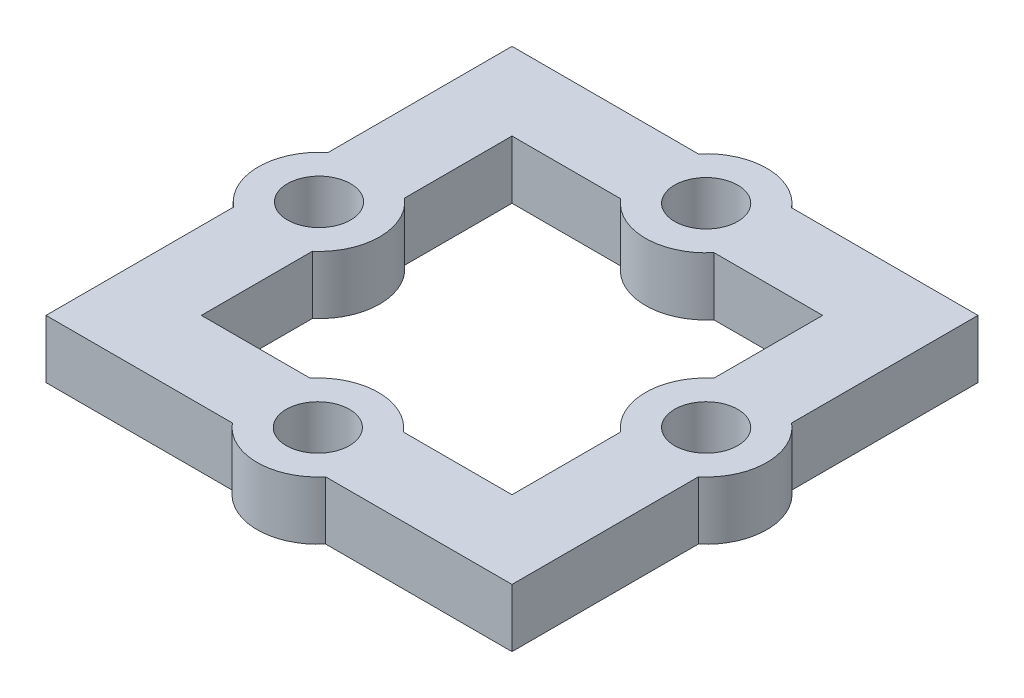
ISO-10303-21;
HEADER;
FILE_DESCRIPTION(('STEP AP214'),'2;1');
FILE_NAME('part.step','',(''),(''),'','','');
FILE_SCHEMA(('AUTOMOTIVE_DESIGN { 1 0 10303 214 1 1 1 1 }'));
ENDSEC;
DATA;
#1=APPLICATION_CONTEXT('core data for automotive mechanical design processes');
#2=APPLICATION_PROTOCOL_DEFINITION('international standard','automotive_design',2000,#1);
#3=PRODUCT_CONTEXT('',#1,'mechanical');
#4=PRODUCT('Part','Part','',(#3));
#5=PRODUCT_RELATED_PRODUCT_CATEGORY('part','',(#4));
#6=PRODUCT_DEFINITION_FORMATION('','',#4);
#7=PRODUCT_DEFINITION_CONTEXT('part definition',#1,'design');
#8=PRODUCT_DEFINITION('design','',#6,#7);
#9=PRODUCT_DEFINITION_SHAPE('','',#8);
#10=(LENGTH_UNIT() NAMED_UNIT(*) SI_UNIT(.MILLI.,.METRE.));
#11=(NAMED_UNIT(*) PLANE_ANGLE_UNIT() SI_UNIT($,.RADIAN.));
#12=(NAMED_UNIT(*) SI_UNIT($,.STERADIAN.) SOLID_ANGLE_UNIT());
#13=UNCERTAINTY_MEASURE_WITH_UNIT(LENGTH_MEASURE(1.E-05),#10,'distance_accuracy_value','');
#14=(GEOMETRIC_REPRESENTATION_CONTEXT(3) GLOBAL_UNCERTAINTY_ASSIGNED_CONTEXT((#13)) GLOBAL_UNIT_ASSIGNED_CONTEXT((#10,
#11,#12)) REPRESENTATION_CONTEXT('',''));
#15=CARTESIAN_POINT('',(0.,0.,0.));
#16=DIRECTION('',(0.,0.,1.));
#17=DIRECTION('',(1.,0.,0.));
#18=AXIS2_PLACEMENT_3D('',#15,#16,#17);
#19=CARTESIAN_POINT('',(20.,6.,0.));
#20=DIRECTION('',(0.,1.,0.));
#21=DIRECTION('',(0.,0.,1.));
#22=AXIS2_PLACEMENT_3D('',#19,#20,#21);
#23=PLANE('',#22);
#24=CARTESIAN_POINT('',(20.,6.,0.));
#25=DIRECTION('',(0.,1.,0.));
#26=DIRECTION('',(0.,0.,1.));
#27=AXIS2_PLACEMENT_3D('',#24,#25,#26);
#28=CIRCLE('',#27,3.25);
#29=CARTESIAN_POINT('',(20.,6.,3.25));
#30=VERTEX_POINT('',#29);
#31=EDGE_CURVE('E752',#30,#30,#28,.T.);
#32=ORIENTED_EDGE('',*,*,#31,.F.);
#33=EDGE_LOOP('',(#32));
#34=FACE_BOUND('',#33,.T.);
#35=CARTESIAN_POINT('',(0.,6.,-20.));
#36=DIRECTION('',(0.,1.,0.));
#37=DIRECTION('',(0.,0.,1.));
#38=AXIS2_PLACEMENT_3D('',#35,#36,#37);
#39=CIRCLE('',#38,3.25);
#40=CARTESIAN_POINT('',(0.,6.,-16.75));
#41=VERTEX_POINT('',#40);
#42=EDGE_CURVE('E474',#41,#41,#39,.T.);
#43=ORIENTED_EDGE('',*,*,#42,.F.);
#44=EDGE_LOOP('',(#43));
#45=FACE_BOUND('',#44,.T.);
#46=DIRECTION('',(1.,0.,0.));
#47=VECTOR('',#46,1.);
#48=CARTESIAN_POINT('',(4.80234317807463,6.,-24.));
#49=LINE('',#48,#47);
#50=CARTESIAN_POINT('',(4.80234317807463,6.,-24.));
#51=VERTEX_POINT('',#50);
#52=CARTESIAN_POINT('',(24.,6.,-24.));
#53=VERTEX_POINT('',#52);
#54=EDGE_CURVE('E523',#51,#53,#49,.T.);
#55=ORIENTED_EDGE('',*,*,#54,.F.);
#56=CARTESIAN_POINT('',(0.,6.,-20.));
#57=DIRECTION('',(0.,1.,0.));
#58=DIRECTION('',(0.,0.,1.));
#59=AXIS2_PLACEMENT_3D('',#56,#57,#58);
#60=CIRCLE('',#59,6.25);
#61=CARTESIAN_POINT('',(-4.80234317807463,6.,-24.));
#62=VERTEX_POINT('',#61);
#63=EDGE_CURVE('E550',#51,#62,#60,.T.);
#64=ORIENTED_EDGE('',*,*,#63,.T.);
#65=DIRECTION('',(1.,0.,0.));
#66=VECTOR('',#65,1.);
#67=CARTESIAN_POINT('',(-24.,6.,-24.));
#68=LINE('',#67,#66);
#69=CARTESIAN_POINT('',(-24.,6.,-24.));
#70=VERTEX_POINT('',#69);
#71=EDGE_CURVE('E547',#70,#62,#68,.T.);
#72=ORIENTED_EDGE('',*,*,#71,.F.);
#73=DIRECTION('',(0.,0.,1.));
#74=VECTOR('',#73,1.);
#75=CARTESIAN_POINT('',(-24.,6.,-24.));
#76=LINE('',#75,#74);
#77=CARTESIAN_POINT('',(-24.,6.,-5.04363246962454));
#78=VERTEX_POINT('',#77);
#79=EDGE_CURVE('E545',#70,#78,#76,.T.);
#80=ORIENTED_EDGE('',*,*,#79,.T.);
#81=CARTESIAN_POINT('',(-20.065667944918,6.,-0.187344660983607));
#82=DIRECTION('',(0.,1.,0.));
#83=DIRECTION('',(0.,0.,1.));
#84=AXIS2_PLACEMENT_3D('',#81,#82,#83);
#85=CIRCLE('',#84,6.25);
#86=CARTESIAN_POINT('',(-24.,6.,4.66894314765733));
#87=VERTEX_POINT('',#86);
#88=EDGE_CURVE('E543',#78,#87,#85,.T.);
#89=ORIENTED_EDGE('',*,*,#88,.T.);
#90=DIRECTION('',(0.,0.,1.));
#91=VECTOR('',#90,1.);
#92=CARTESIAN_POINT('',(-24.,6.,4.66894314765733));
#93=LINE('',#92,#91);
#94=CARTESIAN_POINT('',(-24.,6.,24.));
#95=VERTEX_POINT('',#94);
#96=EDGE_CURVE('E541',#87,#95,#93,.T.);
#97=ORIENTED_EDGE('',*,*,#96,.T.);
#98=DIRECTION('',(1.,0.,0.));
#99=VECTOR('',#98,1.);
#100=CARTESIAN_POINT('',(-24.,6.,24.));
#101=LINE('',#100,#99);
#102=CARTESIAN_POINT('',(-4.80234317807464,6.,24.));
#103=VERTEX_POINT('',#102);
#104=EDGE_CURVE('E539',#95,#103,#101,.T.);
#105=ORIENTED_EDGE('',*,*,#104,.T.);
#106=CARTESIAN_POINT('',(0.,6.,20.));
#107=DIRECTION('',(0.,1.,0.));
#108=DIRECTION('',(0.,0.,1.));
#109=AXIS2_PLACEMENT_3D('',#106,#107,#108);
#110=CIRCLE('',#109,6.25);
#111=CARTESIAN_POINT('',(4.80234317807464,6.,24.));
#112=VERTEX_POINT('',#111);
#113=EDGE_CURVE('E537',#103,#112,#110,.T.);
#114=ORIENTED_EDGE('',*,*,#113,.T.);
#115=DIRECTION('',(1.,0.,0.));
#116=VECTOR('',#115,1.);
#117=CARTESIAN_POINT('',(4.80234317807464,6.,24.));
#118=LINE('',#117,#116);
#119=CARTESIAN_POINT('',(24.,6.,24.));
#120=VERTEX_POINT('',#119);
#121=EDGE_CURVE('E535',#112,#120,#118,.T.);
#122=ORIENTED_EDGE('',*,*,#121,.T.);
#123=DIRECTION('',(0.,0.,1.));
#124=VECTOR('',#123,1.);
#125=CARTESIAN_POINT('',(24.,6.,4.80234317807463));
#126=LINE('',#125,#124);
#127=CARTESIAN_POINT('',(24.,6.,4.80234317807463));
#128=VERTEX_POINT('',#127);
#129=EDGE_CURVE('E532',#128,#120,#126,.T.);
#130=ORIENTED_EDGE('',*,*,#129,.F.);
#131=CARTESIAN_POINT('',(20.,6.,0.));
#132=DIRECTION('',(0.,1.,0.));
#133=DIRECTION('',(0.,0.,1.));
#134=AXIS2_PLACEMENT_3D('',#131,#132,#133);
#135=CIRCLE('',#134,6.25);
#136=CARTESIAN_POINT('',(24.,6.,-4.80234317807464));
#137=VERTEX_POINT('',#136);
#138=EDGE_CURVE('E530',#128,#137,#135,.T.);
#139=ORIENTED_EDGE('',*,*,#138,.T.);
#140=DIRECTION('',(0.,0.,1.));
#141=VECTOR('',#140,1.);
#142=CARTESIAN_POINT('',(24.,6.,-24.));
#143=LINE('',#142,#141);
#144=EDGE_CURVE('E526',#53,#137,#143,.T.);
#145=ORIENTED_EDGE('',*,*,#144,.F.);
#146=EDGE_LOOP('',(#55,#64,#72,#80,#89,#97,#105,#114,#122,#130,#139,#145));
#147=FACE_BOUND('',#146,.T.);
#148=DIRECTION('',(0.,0.,1.));
#149=VECTOR('',#148,1.);
#150=CARTESIAN_POINT('',(16.,6.,4.80234317807464));
#151=LINE('',#150,#149);
#152=CARTESIAN_POINT('',(16.,6.,4.80234317807464));
#153=VERTEX_POINT('',#152);
#154=CARTESIAN_POINT('',(16.,6.,16.));
#155=VERTEX_POINT('',#154);
#156=EDGE_CURVE('E431',#153,#155,#151,.T.);
#157=ORIENTED_EDGE('',*,*,#156,.T.);
#158=DIRECTION('',(1.,0.,0.));
#159=VECTOR('',#158,1.);
#160=CARTESIAN_POINT('',(4.80234317807463,6.,16.));
#161=LINE('',#160,#159);
#162=CARTESIAN_POINT('',(4.80234317807463,6.,16.));
#163=VERTEX_POINT('',#162);
#164=EDGE_CURVE('E422',#163,#155,#161,.T.);
#165=ORIENTED_EDGE('',*,*,#164,.F.);
#166=CARTESIAN_POINT('',(0.,6.,20.));
#167=DIRECTION('',(0.,1.,0.));
#168=DIRECTION('',(0.,0.,1.));
#169=AXIS2_PLACEMENT_3D('',#166,#167,#168);
#170=CIRCLE('',#169,6.25);
#171=CARTESIAN_POINT('',(-4.80234317807463,6.,16.));
#172=VERTEX_POINT('',#171);
#173=EDGE_CURVE('E471',#163,#172,#170,.T.);
#174=ORIENTED_EDGE('',*,*,#173,.T.);
#175=DIRECTION('',(1.,0.,0.));
#176=VECTOR('',#175,1.);
#177=CARTESIAN_POINT('',(-16.,6.,16.));
#178=LINE('',#177,#176);
#179=CARTESIAN_POINT('',(-16.,6.,16.));
#180=VERTEX_POINT('',#179);
#181=EDGE_CURVE('E469',#180,#172,#178,.T.);
#182=ORIENTED_EDGE('',*,*,#181,.F.);
#183=DIRECTION('',(0.,0.,1.));
#184=VECTOR('',#183,1.);
#185=CARTESIAN_POINT('',(-16.,6.,4.55953264537958));
#186=LINE('',#185,#184);
#187=CARTESIAN_POINT('',(-16.,6.,4.55953264537958));
#188=VERTEX_POINT('',#187);
#189=EDGE_CURVE('E467',#188,#180,#186,.T.);
#190=ORIENTED_EDGE('',*,*,#189,.F.);
#191=CARTESIAN_POINT('',(-20.065667944918,6.,-0.187344660983607));
#192=DIRECTION('',(0.,1.,0.));
#193=DIRECTION('',(0.,0.,1.));
#194=AXIS2_PLACEMENT_3D('',#191,#192,#193);
#195=CIRCLE('',#194,6.25);
#196=CARTESIAN_POINT('',(-16.,6.,-4.9342219673468));
#197=VERTEX_POINT('',#196);
#198=EDGE_CURVE('E464',#188,#197,#195,.T.);
#199=ORIENTED_EDGE('',*,*,#198,.T.);
#200=DIRECTION('',(0.,0.,1.));
#201=VECTOR('',#200,1.);
#202=CARTESIAN_POINT('',(-16.,6.,-16.));
#203=LINE('',#202,#201);
#204=CARTESIAN_POINT('',(-16.,6.,-16.));
#205=VERTEX_POINT('',#204);
#206=EDGE_CURVE('E462',#205,#197,#203,.T.);
#207=ORIENTED_EDGE('',*,*,#206,.F.);
#208=DIRECTION('',(1.,0.,0.));
#209=VECTOR('',#208,1.);
#210=CARTESIAN_POINT('',(-16.,6.,-16.));
#211=LINE('',#210,#209);
#212=CARTESIAN_POINT('',(-4.80234317807464,6.,-16.));
#213=VERTEX_POINT('',#212);
#214=EDGE_CURVE('E459',#205,#213,#211,.T.);
#215=ORIENTED_EDGE('',*,*,#214,.T.);
#216=CARTESIAN_POINT('',(0.,6.,-20.));
#217=DIRECTION('',(0.,1.,0.));
#218=DIRECTION('',(0.,0.,1.));
#219=AXIS2_PLACEMENT_3D('',#216,#217,#218);
#220=CIRCLE('',#219,6.25);
#221=CARTESIAN_POINT('',(4.80234317807464,6.,-16.));
#222=VERTEX_POINT('',#221);
#223=EDGE_CURVE('E456',#213,#222,#220,.T.);
#224=ORIENTED_EDGE('',*,*,#223,.T.);
#225=DIRECTION('',(1.,0.,0.));
#226=VECTOR('',#225,1.);
#227=CARTESIAN_POINT('',(4.80234317807464,6.,-16.));
#228=LINE('',#227,#226);
#229=CARTESIAN_POINT('',(16.,6.,-16.));
#230=VERTEX_POINT('',#229);
#231=EDGE_CURVE('E453',#222,#230,#228,.T.);
#232=ORIENTED_EDGE('',*,*,#231,.T.);
#233=DIRECTION('',(0.,0.,1.));
#234=VECTOR('',#233,1.);
#235=CARTESIAN_POINT('',(16.,6.,-16.));
#236=LINE('',#235,#234);
#237=CARTESIAN_POINT('',(16.,6.,-4.80234317807465));
#238=VERTEX_POINT('',#237);
#239=EDGE_CURVE('E448',#230,#238,#236,.T.);
#240=ORIENTED_EDGE('',*,*,#239,.T.);
#241=CARTESIAN_POINT('',(20.,6.,0.));
#242=DIRECTION('',(0.,1.,0.));
#243=DIRECTION('',(0.,0.,1.));
#244=AXIS2_PLACEMENT_3D('',#241,#242,#243);
#245=CIRCLE('',#244,6.25);
#246=EDGE_CURVE('E446',#238,#153,#245,.T.);
#247=ORIENTED_EDGE('',*,*,#246,.T.);
#248=EDGE_LOOP('',(#157,#165,#174,#182,#190,#199,#207,#215,#224,#232,#240,#247));
#249=FACE_BOUND('',#248,.T.);
#250=CARTESIAN_POINT('',(0.,6.,20.));
#251=DIRECTION('',(0.,1.,0.));
#252=DIRECTION('',(0.,0.,1.));
#253=AXIS2_PLACEMENT_3D('',#250,#251,#252);
#254=CIRCLE('',#253,3.25);
#255=CARTESIAN_POINT('',(0.,6.,23.25));
#256=VERTEX_POINT('',#255);
#257=EDGE_CURVE('E758',#256,#256,#254,.T.);
#258=ORIENTED_EDGE('',*,*,#257,.F.);
#259=EDGE_LOOP('',(#258));
#260=FACE_BOUND('',#259,.T.);
#261=CARTESIAN_POINT('',(-20.065667944918,6.,-0.187344660983607));
#262=DIRECTION('',(0.,1.,0.));
#263=DIRECTION('',(0.,0.,1.));
#264=AXIS2_PLACEMENT_3D('',#261,#262,#263);
#265=CIRCLE('',#264,3.25);
#266=CARTESIAN_POINT('',(-20.065667944918,6.,3.06265533901639));
#267=VERTEX_POINT('',#266);
#268=EDGE_CURVE('E743',#267,#267,#265,.T.);
#269=ORIENTED_EDGE('',*,*,#268,.F.);
#270=EDGE_LOOP('',(#269));
#271=FACE_BOUND('',#270,.T.);
#272=ADVANCED_FACE('F261',(#34,#45,#147,#249,#260,#271),#23,.T.);
#273=CARTESIAN_POINT('',(20.,0.,0.));
#274=DIRECTION('',(0.,1.,0.));
#275=DIRECTION('',(0.,0.,1.));
#276=AXIS2_PLACEMENT_3D('',#273,#274,#275);
#277=PLANE('',#276);
#278=DIRECTION('',(1.,0.,0.));
#279=VECTOR('',#278,1.);
#280=CARTESIAN_POINT('',(4.80234317807463,0.,-24.));
#281=LINE('',#280,#279);
#282=CARTESIAN_POINT('',(4.80234317807463,0.,-24.));
#283=VERTEX_POINT('',#282);
#284=CARTESIAN_POINT('',(24.,0.,-24.));
#285=VERTEX_POINT('',#284);
#286=EDGE_CURVE('E440',#283,#285,#281,.T.);
#287=ORIENTED_EDGE('',*,*,#286,.T.);
#288=DIRECTION('',(0.,0.,1.));
#289=VECTOR('',#288,1.);
#290=CARTESIAN_POINT('',(24.,0.,-24.));
#291=LINE('',#290,#289);
#292=CARTESIAN_POINT('',(24.,0.,-4.80234317807464));
#293=VERTEX_POINT('',#292);
#294=EDGE_CURVE('E554',#285,#293,#291,.T.);
#295=ORIENTED_EDGE('',*,*,#294,.T.);
#296=CARTESIAN_POINT('',(20.,0.,0.));
#297=DIRECTION('',(0.,1.,0.));
#298=DIRECTION('',(0.,0.,1.));
#299=AXIS2_PLACEMENT_3D('',#296,#297,#298);
#300=CIRCLE('',#299,6.25);
#301=CARTESIAN_POINT('',(24.,0.,4.80234317807463));
#302=VERTEX_POINT('',#301);
#303=EDGE_CURVE('E557',#302,#293,#300,.T.);
#304=ORIENTED_EDGE('',*,*,#303,.F.);
#305=DIRECTION('',(0.,0.,1.));
#306=VECTOR('',#305,1.);
#307=CARTESIAN_POINT('',(24.,0.,4.80234317807463));
#308=LINE('',#307,#306);
#309=CARTESIAN_POINT('',(24.,0.,24.));
#310=VERTEX_POINT('',#309);
#311=EDGE_CURVE('E560',#302,#310,#308,.T.);
#312=ORIENTED_EDGE('',*,*,#311,.T.);
#313=DIRECTION('',(1.,0.,0.));
#314=VECTOR('',#313,1.);
#315=CARTESIAN_POINT('',(4.80234317807464,0.,24.));
#316=LINE('',#315,#314);
#317=CARTESIAN_POINT('',(4.80234317807464,0.,24.));
#318=VERTEX_POINT('',#317);
#319=EDGE_CURVE('E563',#318,#310,#316,.T.);
#320=ORIENTED_EDGE('',*,*,#319,.F.);
#321=CARTESIAN_POINT('',(0.,0.,20.));
#322=DIRECTION('',(0.,1.,0.));
#323=DIRECTION('',(0.,0.,1.));
#324=AXIS2_PLACEMENT_3D('',#321,#322,#323);
#325=CIRCLE('',#324,6.25);
#326=CARTESIAN_POINT('',(-4.80234317807464,0.,24.));
#327=VERTEX_POINT('',#326);
#328=EDGE_CURVE('E566',#327,#318,#325,.T.);
#329=ORIENTED_EDGE('',*,*,#328,.F.);
#330=DIRECTION('',(1.,0.,0.));
#331=VECTOR('',#330,1.);
#332=CARTESIAN_POINT('',(-24.,0.,24.));
#333=LINE('',#332,#331);
#334=CARTESIAN_POINT('',(-24.,0.,24.));
#335=VERTEX_POINT('',#334);
#336=EDGE_CURVE('E568',#335,#327,#333,.T.);
#337=ORIENTED_EDGE('',*,*,#336,.F.);
#338=DIRECTION('',(0.,0.,1.));
#339=VECTOR('',#338,1.);
#340=CARTESIAN_POINT('',(-24.,0.,4.66894314765733));
#341=LINE('',#340,#339);
#342=CARTESIAN_POINT('',(-24.,0.,4.66894314765733));
#343=VERTEX_POINT('',#342);
#344=EDGE_CURVE('E570',#343,#335,#341,.T.);
#345=ORIENTED_EDGE('',*,*,#344,.F.);
#346=CARTESIAN_POINT('',(-20.065667944918,0.,-0.187344660983607));
#347=DIRECTION('',(0.,1.,0.));
#348=DIRECTION('',(0.,0.,1.));
#349=AXIS2_PLACEMENT_3D('',#346,#347,#348);
#350=CIRCLE('',#349,6.25);
#351=CARTESIAN_POINT('',(-24.,0.,-5.04363246962454));
#352=VERTEX_POINT('',#351);
#353=EDGE_CURVE('E572',#352,#343,#350,.T.);
#354=ORIENTED_EDGE('',*,*,#353,.F.);
#355=DIRECTION('',(0.,0.,1.));
#356=VECTOR('',#355,1.);
#357=CARTESIAN_POINT('',(-24.,0.,-24.));
#358=LINE('',#357,#356);
#359=CARTESIAN_POINT('',(-24.,0.,-24.));
#360=VERTEX_POINT('',#359);
#361=EDGE_CURVE('E574',#360,#352,#358,.T.);
#362=ORIENTED_EDGE('',*,*,#361,.F.);
#363=DIRECTION('',(1.,0.,0.));
#364=VECTOR('',#363,1.);
#365=CARTESIAN_POINT('',(-24.,0.,-24.));
#366=LINE('',#365,#364);
#367=CARTESIAN_POINT('',(-4.80234317807463,0.,-24.));
#368=VERTEX_POINT('',#367);
#369=EDGE_CURVE('E576',#360,#368,#366,.T.);
#370=ORIENTED_EDGE('',*,*,#369,.T.);
#371=CARTESIAN_POINT('',(0.,0.,-20.));
#372=DIRECTION('',(0.,1.,0.));
#373=DIRECTION('',(0.,0.,1.));
#374=AXIS2_PLACEMENT_3D('',#371,#372,#373);
#375=CIRCLE('',#374,6.25);
#376=EDGE_CURVE('E527',#283,#368,#375,.T.);
#377=ORIENTED_EDGE('',*,*,#376,.F.);
#378=EDGE_LOOP('',(#287,#295,#304,#312,#320,#329,#337,#345,#354,#362,#370,#377));
#379=FACE_BOUND('',#378,.T.);
#380=DIRECTION('',(1.,0.,0.));
#381=VECTOR('',#380,1.);
#382=CARTESIAN_POINT('',(4.80234317807463,0.,16.));
#383=LINE('',#382,#381);
#384=CARTESIAN_POINT('',(4.80234317807463,0.,16.));
#385=VERTEX_POINT('',#384);
#386=CARTESIAN_POINT('',(16.,0.,16.));
#387=VERTEX_POINT('',#386);
#388=EDGE_CURVE('E286',#385,#387,#383,.T.);
#389=ORIENTED_EDGE('',*,*,#388,.T.);
#390=DIRECTION('',(0.,0.,1.));
#391=VECTOR('',#390,1.);
#392=CARTESIAN_POINT('',(16.,0.,4.80234317807464));
#393=LINE('',#392,#391);
#394=CARTESIAN_POINT('',(16.,0.,4.80234317807464));
#395=VERTEX_POINT('',#394);
#396=EDGE_CURVE('E439',#395,#387,#393,.T.);
#397=ORIENTED_EDGE('',*,*,#396,.F.);
#398=CARTESIAN_POINT('',(20.,0.,0.));
#399=DIRECTION('',(0.,1.,0.));
#400=DIRECTION('',(0.,0.,1.));
#401=AXIS2_PLACEMENT_3D('',#398,#399,#400);
#402=CIRCLE('',#401,6.25);
#403=CARTESIAN_POINT('',(16.,0.,-4.80234317807465));
#404=VERTEX_POINT('',#403);
#405=EDGE_CURVE('E476',#404,#395,#402,.T.);
#406=ORIENTED_EDGE('',*,*,#405,.F.);
#407=DIRECTION('',(0.,0.,1.));
#408=VECTOR('',#407,1.);
#409=CARTESIAN_POINT('',(16.,0.,-16.));
#410=LINE('',#409,#408);
#411=CARTESIAN_POINT('',(16.,0.,-16.));
#412=VERTEX_POINT('',#411);
#413=EDGE_CURVE('E479',#412,#404,#410,.T.);
#414=ORIENTED_EDGE('',*,*,#413,.F.);
#415=DIRECTION('',(1.,0.,0.));
#416=VECTOR('',#415,1.);
#417=CARTESIAN_POINT('',(4.80234317807464,0.,-16.));
#418=LINE('',#417,#416);
#419=CARTESIAN_POINT('',(4.80234317807464,0.,-16.));
#420=VERTEX_POINT('',#419);
#421=EDGE_CURVE('E482',#420,#412,#418,.T.);
#422=ORIENTED_EDGE('',*,*,#421,.F.);
#423=CARTESIAN_POINT('',(0.,0.,-20.));
#424=DIRECTION('',(0.,1.,0.));
#425=DIRECTION('',(0.,0.,1.));
#426=AXIS2_PLACEMENT_3D('',#423,#424,#425);
#427=CIRCLE('',#426,6.25);
#428=CARTESIAN_POINT('',(-4.80234317807464,0.,-16.));
#429=VERTEX_POINT('',#428);
#430=EDGE_CURVE('E485',#429,#420,#427,.T.);
#431=ORIENTED_EDGE('',*,*,#430,.F.);
#432=DIRECTION('',(1.,0.,0.));
#433=VECTOR('',#432,1.);
#434=CARTESIAN_POINT('',(-16.,0.,-16.));
#435=LINE('',#434,#433);
#436=CARTESIAN_POINT('',(-16.,0.,-16.));
#437=VERTEX_POINT('',#436);
#438=EDGE_CURVE('E488',#437,#429,#435,.T.);
#439=ORIENTED_EDGE('',*,*,#438,.F.);
#440=DIRECTION('',(0.,0.,1.));
#441=VECTOR('',#440,1.);
#442=CARTESIAN_POINT('',(-16.,0.,-16.));
#443=LINE('',#442,#441);
#444=CARTESIAN_POINT('',(-16.,0.,-4.9342219673468));
#445=VERTEX_POINT('',#444);
#446=EDGE_CURVE('E491',#437,#445,#443,.T.);
#447=ORIENTED_EDGE('',*,*,#446,.T.);
#448=CARTESIAN_POINT('',(-20.065667944918,0.,-0.187344660983607));
#449=DIRECTION('',(0.,1.,0.));
#450=DIRECTION('',(0.,0.,1.));
#451=AXIS2_PLACEMENT_3D('',#448,#449,#450);
#452=CIRCLE('',#451,6.25);
#453=CARTESIAN_POINT('',(-16.,0.,4.55953264537958));
#454=VERTEX_POINT('',#453);
#455=EDGE_CURVE('E494',#454,#445,#452,.T.);
#456=ORIENTED_EDGE('',*,*,#455,.F.);
#457=DIRECTION('',(0.,0.,1.));
#458=VECTOR('',#457,1.);
#459=CARTESIAN_POINT('',(-16.,0.,4.55953264537958));
#460=LINE('',#459,#458);
#461=CARTESIAN_POINT('',(-16.,0.,16.));
#462=VERTEX_POINT('',#461);
#463=EDGE_CURVE('E497',#454,#462,#460,.T.);
#464=ORIENTED_EDGE('',*,*,#463,.T.);
#465=DIRECTION('',(1.,0.,0.));
#466=VECTOR('',#465,1.);
#467=CARTESIAN_POINT('',(-16.,0.,16.));
#468=LINE('',#467,#466);
#469=CARTESIAN_POINT('',(-4.80234317807463,0.,16.));
#470=VERTEX_POINT('',#469);
#471=EDGE_CURVE('E500',#462,#470,#468,.T.);
#472=ORIENTED_EDGE('',*,*,#471,.T.);
#473=CARTESIAN_POINT('',(0.,0.,20.));
#474=DIRECTION('',(0.,1.,0.));
#475=DIRECTION('',(0.,0.,1.));
#476=AXIS2_PLACEMENT_3D('',#473,#474,#475);
#477=CIRCLE('',#476,6.25);
#478=EDGE_CURVE('E432',#385,#470,#477,.T.);
#479=ORIENTED_EDGE('',*,*,#478,.F.);
#480=EDGE_LOOP('',(#389,#397,#406,#414,#422,#431,#439,#447,#456,#464,#472,#479));
#481=FACE_BOUND('',#480,.T.);
#482=CARTESIAN_POINT('',(0.,0.,-20.));
#483=DIRECTION('',(0.,1.,0.));
#484=DIRECTION('',(0.,0.,1.));
#485=AXIS2_PLACEMENT_3D('',#482,#483,#484);
#486=CIRCLE('',#485,3.25);
#487=CARTESIAN_POINT('',(0.,0.,-16.75));
#488=VERTEX_POINT('',#487);
#489=EDGE_CURVE('E761',#488,#488,#486,.T.);
#490=ORIENTED_EDGE('',*,*,#489,.T.);
#491=EDGE_LOOP('',(#490));
#492=FACE_BOUND('',#491,.T.);
#493=CARTESIAN_POINT('',(0.,0.,20.));
#494=DIRECTION('',(0.,1.,0.));
#495=DIRECTION('',(0.,0.,1.));
#496=AXIS2_PLACEMENT_3D('',#493,#494,#495);
#497=CIRCLE('',#496,3.25);
#498=CARTESIAN_POINT('',(0.,0.,23.25));
#499=VERTEX_POINT('',#498);
#500=EDGE_CURVE('E755',#499,#499,#497,.T.);
#501=ORIENTED_EDGE('',*,*,#500,.T.);
#502=EDGE_LOOP('',(#501));
#503=FACE_BOUND('',#502,.T.);
#504=CARTESIAN_POINT('',(20.,0.,0.));
#505=DIRECTION('',(0.,1.,0.));
#506=DIRECTION('',(0.,0.,1.));
#507=AXIS2_PLACEMENT_3D('',#504,#505,#506);
#508=CIRCLE('',#507,3.25);
#509=CARTESIAN_POINT('',(20.,0.,3.25));
#510=VERTEX_POINT('',#509);
#511=EDGE_CURVE('E749',#510,#510,#508,.T.);
#512=ORIENTED_EDGE('',*,*,#511,.T.);
#513=EDGE_LOOP('',(#512));
#514=FACE_BOUND('',#513,.T.);
#515=CARTESIAN_POINT('',(-20.065667944918,0.,-0.187344660983607));
#516=DIRECTION('',(0.,1.,0.));
#517=DIRECTION('',(0.,0.,1.));
#518=AXIS2_PLACEMENT_3D('',#515,#516,#517);
#519=CIRCLE('',#518,3.25);
#520=CARTESIAN_POINT('',(-20.065667944918,0.,3.06265533901639));
#521=VERTEX_POINT('',#520);
#522=EDGE_CURVE('E746',#521,#521,#519,.T.);
#523=ORIENTED_EDGE('',*,*,#522,.T.);
#524=EDGE_LOOP('',(#523));
#525=FACE_BOUND('',#524,.T.);
#526=ADVANCED_FACE('F614',(#379,#481,#492,#503,#514,#525),#277,.F.);
#527=CARTESIAN_POINT('',(4.80234317807463,6.,-24.));
#528=DIRECTION('',(0.,0.,-1.));
#529=DIRECTION('',(-1.,0.,0.));
#530=AXIS2_PLACEMENT_3D('',#527,#528,#529);
#531=PLANE('',#530);
#532=ORIENTED_EDGE('',*,*,#286,.F.);
#533=DIRECTION('',(0.,-1.,0.));
#534=VECTOR('',#533,1.);
#535=CARTESIAN_POINT('',(4.80234317807463,6.,-24.));
#536=LINE('',#535,#534);
#537=EDGE_CURVE('E12',#51,#283,#536,.T.);
#538=ORIENTED_EDGE('',*,*,#537,.F.);
#539=ORIENTED_EDGE('',*,*,#54,.T.);
#540=DIRECTION('',(0.,-1.,0.));
#541=VECTOR('',#540,1.);
#542=CARTESIAN_POINT('',(24.,6.,-24.));
#543=LINE('',#542,#541);
#544=EDGE_CURVE('E265',#53,#285,#543,.T.);
#545=ORIENTED_EDGE('',*,*,#544,.T.);
#546=EDGE_LOOP('',(#532,#538,#539,#545));
#547=FACE_BOUND('',#546,.T.);
#548=ADVANCED_FACE('F263',(#547),#531,.T.);
#549=CARTESIAN_POINT('',(0.,6.,-20.));
#550=DIRECTION('',(0.,-1.,0.));
#551=DIRECTION('',(0.,0.,-1.));
#552=AXIS2_PLACEMENT_3D('',#549,#550,#551);
#553=CYLINDRICAL_SURFACE('',#552,6.25);
#554=ORIENTED_EDGE('',*,*,#376,.T.);
#555=DIRECTION('',(0.,-1.,0.));
#556=VECTOR('',#555,1.);
#557=CARTESIAN_POINT('',(-4.80234317807463,6.,-24.));
#558=LINE('',#557,#556);
#559=EDGE_CURVE('E270',#62,#368,#558,.T.);
#560=ORIENTED_EDGE('',*,*,#559,.F.);
#561=ORIENTED_EDGE('',*,*,#63,.F.);
#562=ORIENTED_EDGE('',*,*,#537,.T.);
#563=EDGE_LOOP('',(#554,#560,#561,#562));
#564=FACE_BOUND('',#563,.T.);
#565=ADVANCED_FACE('F620',(#564),#553,.T.);
#566=CARTESIAN_POINT('',(-24.,6.,-24.));
#567=DIRECTION('',(0.,0.,-1.));
#568=DIRECTION('',(-1.,0.,0.));
#569=AXIS2_PLACEMENT_3D('',#566,#567,#568);
#570=PLANE('',#569);
#571=ORIENTED_EDGE('',*,*,#369,.F.);
#572=DIRECTION('',(0.,-1.,0.));
#573=VECTOR('',#572,1.);
#574=CARTESIAN_POINT('',(-24.,6.,-24.));
#575=LINE('',#574,#573);
#576=EDGE_CURVE('E582',#70,#360,#575,.T.);
#577=ORIENTED_EDGE('',*,*,#576,.F.);
#578=ORIENTED_EDGE('',*,*,#71,.T.);
#579=ORIENTED_EDGE('',*,*,#559,.T.);
#580=EDGE_LOOP('',(#571,#577,#578,#579));
#581=FACE_BOUND('',#580,.T.);
#582=ADVANCED_FACE('F661',(#581),#570,.T.);
#583=CARTESIAN_POINT('',(-24.,6.,-24.));
#584=DIRECTION('',(1.,0.,0.));
#585=DIRECTION('',(0.,0.,-1.));
#586=AXIS2_PLACEMENT_3D('',#583,#584,#585);
#587=PLANE('',#586);
#588=ORIENTED_EDGE('',*,*,#361,.T.);
#589=DIRECTION('',(0.,-1.,0.));
#590=VECTOR('',#589,1.);
#591=CARTESIAN_POINT('',(-24.,6.,-5.04363246962454));
#592=LINE('',#591,#590);
#593=EDGE_CURVE('E584',#78,#352,#592,.T.);
#594=ORIENTED_EDGE('',*,*,#593,.F.);
#595=ORIENTED_EDGE('',*,*,#79,.F.);
#596=ORIENTED_EDGE('',*,*,#576,.T.);
#597=EDGE_LOOP('',(#588,#594,#595,#596));
#598=FACE_BOUND('',#597,.T.);
#599=ADVANCED_FACE('F659',(#598),#587,.F.);
#600=CARTESIAN_POINT('',(-20.065667944918,6.,-0.187344660983607));
#601=DIRECTION('',(0.,-1.,0.));
#602=DIRECTION('',(0.,0.,-1.));
#603=AXIS2_PLACEMENT_3D('',#600,#601,#602);
#604=CYLINDRICAL_SURFACE('',#603,6.25);
#605=ORIENTED_EDGE('',*,*,#353,.T.);
#606=DIRECTION('',(0.,-1.,0.));
#607=VECTOR('',#606,1.);
#608=CARTESIAN_POINT('',(-24.,6.,4.66894314765733));
#609=LINE('',#608,#607);
#610=EDGE_CURVE('E587',#87,#343,#609,.T.);
#611=ORIENTED_EDGE('',*,*,#610,.F.);
#612=ORIENTED_EDGE('',*,*,#88,.F.);
#613=ORIENTED_EDGE('',*,*,#593,.T.);
#614=EDGE_LOOP('',(#605,#611,#612,#613));
#615=FACE_BOUND('',#614,.T.);
#616=ADVANCED_FACE('F654',(#615),#604,.T.);
#617=CARTESIAN_POINT('',(-24.,6.,4.66894314765733));
#618=DIRECTION('',(1.,0.,0.));
#619=DIRECTION('',(0.,0.,-1.));
#620=AXIS2_PLACEMENT_3D('',#617,#618,#619);
#621=PLANE('',#620);
#622=ORIENTED_EDGE('',*,*,#344,.T.);
#623=DIRECTION('',(0.,-1.,0.));
#624=VECTOR('',#623,1.);
#625=CARTESIAN_POINT('',(-24.,6.,24.));
#626=LINE('',#625,#624);
#627=EDGE_CURVE('E590',#95,#335,#626,.T.);
#628=ORIENTED_EDGE('',*,*,#627,.F.);
#629=ORIENTED_EDGE('',*,*,#96,.F.);
#630=ORIENTED_EDGE('',*,*,#610,.T.);
#631=EDGE_LOOP('',(#622,#628,#629,#630));
#632=FACE_BOUND('',#631,.T.);
#633=ADVANCED_FACE('F650',(#632),#621,.F.);
#634=CARTESIAN_POINT('',(-24.,6.,24.));
#635=DIRECTION('',(0.,0.,-1.));
#636=DIRECTION('',(-1.,0.,0.));
#637=AXIS2_PLACEMENT_3D('',#634,#635,#636);
#638=PLANE('',#637);
#639=ORIENTED_EDGE('',*,*,#336,.T.);
#640=DIRECTION('',(0.,-1.,0.));
#641=VECTOR('',#640,1.);
#642=CARTESIAN_POINT('',(-4.80234317807464,6.,24.));
#643=LINE('',#642,#641);
#644=EDGE_CURVE('E593',#103,#327,#643,.T.);
#645=ORIENTED_EDGE('',*,*,#644,.F.);
#646=ORIENTED_EDGE('',*,*,#104,.F.);
#647=ORIENTED_EDGE('',*,*,#627,.T.);
#648=EDGE_LOOP('',(#639,#645,#646,#647));
#649=FACE_BOUND('',#648,.T.);
#650=ADVANCED_FACE('F646',(#649),#638,.F.);
#651=CARTESIAN_POINT('',(0.,6.,20.));
#652=DIRECTION('',(0.,-1.,0.));
#653=DIRECTION('',(0.,0.,-1.));
#654=AXIS2_PLACEMENT_3D('',#651,#652,#653);
#655=CYLINDRICAL_SURFACE('',#654,6.25);
#656=ORIENTED_EDGE('',*,*,#328,.T.);
#657=DIRECTION('',(0.,-1.,0.));
#658=VECTOR('',#657,1.);
#659=CARTESIAN_POINT('',(4.80234317807464,6.,24.));
#660=LINE('',#659,#658);
#661=EDGE_CURVE('E596',#112,#318,#660,.T.);
#662=ORIENTED_EDGE('',*,*,#661,.F.);
#663=ORIENTED_EDGE('',*,*,#113,.F.);
#664=ORIENTED_EDGE('',*,*,#644,.T.);
#665=EDGE_LOOP('',(#656,#662,#663,#664));
#666=FACE_BOUND('',#665,.T.);
#667=ADVANCED_FACE('F641',(#666),#655,.T.);
#668=CARTESIAN_POINT('',(4.80234317807464,6.,24.));
#669=DIRECTION('',(0.,0.,-1.));
#670=DIRECTION('',(-1.,0.,0.));
#671=AXIS2_PLACEMENT_3D('',#668,#669,#670);
#672=PLANE('',#671);
#673=ORIENTED_EDGE('',*,*,#319,.T.);
#674=DIRECTION('',(0.,-1.,0.));
#675=VECTOR('',#674,1.);
#676=CARTESIAN_POINT('',(24.,6.,24.));
#677=LINE('',#676,#675);
#678=EDGE_CURVE('E599',#120,#310,#677,.T.);
#679=ORIENTED_EDGE('',*,*,#678,.F.);
#680=ORIENTED_EDGE('',*,*,#121,.F.);
#681=ORIENTED_EDGE('',*,*,#661,.T.);
#682=EDGE_LOOP('',(#673,#679,#680,#681));
#683=FACE_BOUND('',#682,.T.);
#684=ADVANCED_FACE('F635',(#683),#672,.F.);
#685=CARTESIAN_POINT('',(24.,6.,4.80234317807463));
#686=DIRECTION('',(1.,0.,0.));
#687=DIRECTION('',(0.,0.,-1.));
#688=AXIS2_PLACEMENT_3D('',#685,#686,#687);
#689=PLANE('',#688);
#690=ORIENTED_EDGE('',*,*,#311,.F.);
#691=DIRECTION('',(0.,-1.,0.));
#692=VECTOR('',#691,1.);
#693=CARTESIAN_POINT('',(24.,6.,4.80234317807463));
#694=LINE('',#693,#692);
#695=EDGE_CURVE('E601',#128,#302,#694,.T.);
#696=ORIENTED_EDGE('',*,*,#695,.F.);
#697=ORIENTED_EDGE('',*,*,#129,.T.);
#698=ORIENTED_EDGE('',*,*,#678,.T.);
#699=EDGE_LOOP('',(#690,#696,#697,#698));
#700=FACE_BOUND('',#699,.T.);
#701=ADVANCED_FACE('F631',(#700),#689,.T.);
#702=CARTESIAN_POINT('',(20.,6.,0.));
#703=DIRECTION('',(0.,-1.,0.));
#704=DIRECTION('',(0.,0.,-1.));
#705=AXIS2_PLACEMENT_3D('',#702,#703,#704);
#706=CYLINDRICAL_SURFACE('',#705,6.25);
#707=ORIENTED_EDGE('',*,*,#303,.T.);
#708=DIRECTION('',(0.,-1.,0.));
#709=VECTOR('',#708,1.);
#710=CARTESIAN_POINT('',(24.,6.,-4.80234317807464));
#711=LINE('',#710,#709);
#712=EDGE_CURVE('E602',#137,#293,#711,.T.);
#713=ORIENTED_EDGE('',*,*,#712,.F.);
#714=ORIENTED_EDGE('',*,*,#138,.F.);
#715=ORIENTED_EDGE('',*,*,#695,.T.);
#716=EDGE_LOOP('',(#707,#713,#714,#715));
#717=FACE_BOUND('',#716,.T.);
#718=ADVANCED_FACE('F627',(#717),#706,.T.);
#719=CARTESIAN_POINT('',(24.,6.,-24.));
#720=DIRECTION('',(1.,0.,0.));
#721=DIRECTION('',(0.,0.,-1.));
#722=AXIS2_PLACEMENT_3D('',#719,#720,#721);
#723=PLANE('',#722);
#724=ORIENTED_EDGE('',*,*,#294,.F.);
#725=ORIENTED_EDGE('',*,*,#544,.F.);
#726=ORIENTED_EDGE('',*,*,#144,.T.);
#727=ORIENTED_EDGE('',*,*,#712,.T.);
#728=EDGE_LOOP('',(#724,#725,#726,#727));
#729=FACE_BOUND('',#728,.T.);
#730=ADVANCED_FACE('F610',(#729),#723,.T.);
#731=CARTESIAN_POINT('',(4.80234317807463,6.,16.));
#732=DIRECTION('',(0.,0.,-1.));
#733=DIRECTION('',(-1.,0.,0.));
#734=AXIS2_PLACEMENT_3D('',#731,#732,#733);
#735=PLANE('',#734);
#736=ORIENTED_EDGE('',*,*,#388,.F.);
#737=DIRECTION('',(0.,-1.,0.));
#738=VECTOR('',#737,1.);
#739=CARTESIAN_POINT('',(4.80234317807463,6.,16.));
#740=LINE('',#739,#738);
#741=EDGE_CURVE('E427',#163,#385,#740,.T.);
#742=ORIENTED_EDGE('',*,*,#741,.F.);
#743=ORIENTED_EDGE('',*,*,#164,.T.);
#744=DIRECTION('',(0.,-1.,0.));
#745=VECTOR('',#744,1.);
#746=CARTESIAN_POINT('',(16.,6.,16.));
#747=LINE('',#746,#745);
#748=EDGE_CURVE('E425',#155,#387,#747,.T.);
#749=ORIENTED_EDGE('',*,*,#748,.T.);
#750=EDGE_LOOP('',(#736,#742,#743,#749));
#751=FACE_BOUND('',#750,.T.);
#752=ADVANCED_FACE('F424',(#751),#735,.T.);
#753=CARTESIAN_POINT('',(16.,6.,4.80234317807464));
#754=DIRECTION('',(1.,0.,0.));
#755=DIRECTION('',(0.,0.,-1.));
#756=AXIS2_PLACEMENT_3D('',#753,#754,#755);
#757=PLANE('',#756);
#758=ORIENTED_EDGE('',*,*,#396,.T.);
#759=ORIENTED_EDGE('',*,*,#748,.F.);
#760=ORIENTED_EDGE('',*,*,#156,.F.);
#761=DIRECTION('',(0.,-1.,0.));
#762=VECTOR('',#761,1.);
#763=CARTESIAN_POINT('',(16.,6.,4.80234317807464));
#764=LINE('',#763,#762);
#765=EDGE_CURVE('E441',#153,#395,#764,.T.);
#766=ORIENTED_EDGE('',*,*,#765,.T.);
#767=EDGE_LOOP('',(#758,#759,#760,#766));
#768=FACE_BOUND('',#767,.T.);
#769=ADVANCED_FACE('F436',(#768),#757,.F.);
#770=CARTESIAN_POINT('',(20.,6.,0.));
#771=DIRECTION('',(0.,-1.,0.));
#772=DIRECTION('',(0.,0.,-1.));
#773=AXIS2_PLACEMENT_3D('',#770,#771,#772);
#774=CYLINDRICAL_SURFACE('',#773,6.25);
#775=ORIENTED_EDGE('',*,*,#405,.T.);
#776=ORIENTED_EDGE('',*,*,#765,.F.);
#777=ORIENTED_EDGE('',*,*,#246,.F.);
#778=DIRECTION('',(0.,-1.,0.));
#779=VECTOR('',#778,1.);
#780=CARTESIAN_POINT('',(16.,6.,-4.80234317807465));
#781=LINE('',#780,#779);
#782=EDGE_CURVE('E520',#238,#404,#781,.T.);
#783=ORIENTED_EDGE('',*,*,#782,.T.);
#784=EDGE_LOOP('',(#775,#776,#777,#783));
#785=FACE_BOUND('',#784,.T.);
#786=ADVANCED_FACE('F684',(#785),#774,.T.);
#787=CARTESIAN_POINT('',(16.,6.,-16.));
#788=DIRECTION('',(1.,0.,0.));
#789=DIRECTION('',(0.,0.,-1.));
#790=AXIS2_PLACEMENT_3D('',#787,#788,#789);
#791=PLANE('',#790);
#792=ORIENTED_EDGE('',*,*,#413,.T.);
#793=ORIENTED_EDGE('',*,*,#782,.F.);
#794=ORIENTED_EDGE('',*,*,#239,.F.);
#795=DIRECTION('',(0.,-1.,0.));
#796=VECTOR('',#795,1.);
#797=CARTESIAN_POINT('',(16.,6.,-16.));
#798=LINE('',#797,#796);
#799=EDGE_CURVE('E518',#230,#412,#798,.T.);
#800=ORIENTED_EDGE('',*,*,#799,.T.);
#801=EDGE_LOOP('',(#792,#793,#794,#800));
#802=FACE_BOUND('',#801,.T.);
#803=ADVANCED_FACE('F687',(#802),#791,.F.);
#804=CARTESIAN_POINT('',(4.80234317807464,6.,-16.));
#805=DIRECTION('',(0.,0.,-1.));
#806=DIRECTION('',(-1.,0.,0.));
#807=AXIS2_PLACEMENT_3D('',#804,#805,#806);
#808=PLANE('',#807);
#809=ORIENTED_EDGE('',*,*,#421,.T.);
#810=ORIENTED_EDGE('',*,*,#799,.F.);
#811=ORIENTED_EDGE('',*,*,#231,.F.);
#812=DIRECTION('',(0.,-1.,0.));
#813=VECTOR('',#812,1.);
#814=CARTESIAN_POINT('',(4.80234317807464,6.,-16.));
#815=LINE('',#814,#813);
#816=EDGE_CURVE('E516',#222,#420,#815,.T.);
#817=ORIENTED_EDGE('',*,*,#816,.T.);
#818=EDGE_LOOP('',(#809,#810,#811,#817));
#819=FACE_BOUND('',#818,.T.);
#820=ADVANCED_FACE('F691',(#819),#808,.F.);
#821=CARTESIAN_POINT('',(0.,6.,-20.));
#822=DIRECTION('',(0.,-1.,0.));
#823=DIRECTION('',(0.,0.,-1.));
#824=AXIS2_PLACEMENT_3D('',#821,#822,#823);
#825=CYLINDRICAL_SURFACE('',#824,6.25);
#826=ORIENTED_EDGE('',*,*,#430,.T.);
#827=ORIENTED_EDGE('',*,*,#816,.F.);
#828=ORIENTED_EDGE('',*,*,#223,.F.);
#829=DIRECTION('',(0.,-1.,0.));
#830=VECTOR('',#829,1.);
#831=CARTESIAN_POINT('',(-4.80234317807464,6.,-16.));
#832=LINE('',#831,#830);
#833=EDGE_CURVE('E514',#213,#429,#832,.T.);
#834=ORIENTED_EDGE('',*,*,#833,.T.);
#835=EDGE_LOOP('',(#826,#827,#828,#834));
#836=FACE_BOUND('',#835,.T.);
#837=ADVANCED_FACE('F695',(#836),#825,.T.);
#838=CARTESIAN_POINT('',(-16.,6.,-16.));
#839=DIRECTION('',(0.,0.,-1.));
#840=DIRECTION('',(-1.,0.,0.));
#841=AXIS2_PLACEMENT_3D('',#838,#839,#840);
#842=PLANE('',#841);
#843=ORIENTED_EDGE('',*,*,#438,.T.);
#844=ORIENTED_EDGE('',*,*,#833,.F.);
#845=ORIENTED_EDGE('',*,*,#214,.F.);
#846=DIRECTION('',(0.,-1.,0.));
#847=VECTOR('',#846,1.);
#848=CARTESIAN_POINT('',(-16.,6.,-16.));
#849=LINE('',#848,#847);
#850=EDGE_CURVE('E512',#205,#437,#849,.T.);
#851=ORIENTED_EDGE('',*,*,#850,.T.);
#852=EDGE_LOOP('',(#843,#844,#845,#851));
#853=FACE_BOUND('',#852,.T.);
#854=ADVANCED_FACE('F699',(#853),#842,.F.);
#855=CARTESIAN_POINT('',(-16.,6.,-16.));
#856=DIRECTION('',(1.,0.,0.));
#857=DIRECTION('',(0.,0.,-1.));
#858=AXIS2_PLACEMENT_3D('',#855,#856,#857);
#859=PLANE('',#858);
#860=ORIENTED_EDGE('',*,*,#446,.F.);
#861=ORIENTED_EDGE('',*,*,#850,.F.);
#862=ORIENTED_EDGE('',*,*,#206,.T.);
#863=DIRECTION('',(0.,-1.,0.));
#864=VECTOR('',#863,1.);
#865=CARTESIAN_POINT('',(-16.,6.,-4.9342219673468));
#866=LINE('',#865,#864);
#867=EDGE_CURVE('E510',#197,#445,#866,.T.);
#868=ORIENTED_EDGE('',*,*,#867,.T.);
#869=EDGE_LOOP('',(#860,#861,#862,#868));
#870=FACE_BOUND('',#869,.T.);
#871=ADVANCED_FACE('F703',(#870),#859,.T.);
#872=CARTESIAN_POINT('',(-20.065667944918,6.,-0.187344660983607));
#873=DIRECTION('',(0.,-1.,0.));
#874=DIRECTION('',(0.,0.,-1.));
#875=AXIS2_PLACEMENT_3D('',#872,#873,#874);
#876=CYLINDRICAL_SURFACE('',#875,6.25);
#877=ORIENTED_EDGE('',*,*,#455,.T.);
#878=ORIENTED_EDGE('',*,*,#867,.F.);
#879=ORIENTED_EDGE('',*,*,#198,.F.);
#880=DIRECTION('',(0.,-1.,0.));
#881=VECTOR('',#880,1.);
#882=CARTESIAN_POINT('',(-16.,6.,4.55953264537958));
#883=LINE('',#882,#881);
#884=EDGE_CURVE('E508',#188,#454,#883,.T.);
#885=ORIENTED_EDGE('',*,*,#884,.T.);
#886=EDGE_LOOP('',(#877,#878,#879,#885));
#887=FACE_BOUND('',#886,.T.);
#888=ADVANCED_FACE('F707',(#887),#876,.T.);
#889=CARTESIAN_POINT('',(-16.,6.,4.55953264537958));
#890=DIRECTION('',(1.,0.,0.));
#891=DIRECTION('',(0.,0.,-1.));
#892=AXIS2_PLACEMENT_3D('',#889,#890,#891);
#893=PLANE('',#892);
#894=ORIENTED_EDGE('',*,*,#463,.F.);
#895=ORIENTED_EDGE('',*,*,#884,.F.);
#896=ORIENTED_EDGE('',*,*,#189,.T.);
#897=DIRECTION('',(0.,-1.,0.));
#898=VECTOR('',#897,1.);
#899=CARTESIAN_POINT('',(-16.,6.,16.));
#900=LINE('',#899,#898);
#901=EDGE_CURVE('E506',#180,#462,#900,.T.);
#902=ORIENTED_EDGE('',*,*,#901,.T.);
#903=EDGE_LOOP('',(#894,#895,#896,#902));
#904=FACE_BOUND('',#903,.T.);
#905=ADVANCED_FACE('F711',(#904),#893,.T.);
#906=CARTESIAN_POINT('',(-16.,6.,16.));
#907=DIRECTION('',(0.,0.,-1.));
#908=DIRECTION('',(-1.,0.,0.));
#909=AXIS2_PLACEMENT_3D('',#906,#907,#908);
#910=PLANE('',#909);
#911=ORIENTED_EDGE('',*,*,#471,.F.);
#912=ORIENTED_EDGE('',*,*,#901,.F.);
#913=ORIENTED_EDGE('',*,*,#181,.T.);
#914=DIRECTION('',(0.,-1.,0.));
#915=VECTOR('',#914,1.);
#916=CARTESIAN_POINT('',(-4.80234317807463,6.,16.));
#917=LINE('',#916,#915);
#918=EDGE_CURVE('E278',#172,#470,#917,.T.);
#919=ORIENTED_EDGE('',*,*,#918,.T.);
#920=EDGE_LOOP('',(#911,#912,#913,#919));
#921=FACE_BOUND('',#920,.T.);
#922=ADVANCED_FACE('F715',(#921),#910,.T.);
#923=CARTESIAN_POINT('',(0.,6.,20.));
#924=DIRECTION('',(0.,-1.,0.));
#925=DIRECTION('',(0.,0.,-1.));
#926=AXIS2_PLACEMENT_3D('',#923,#924,#925);
#927=CYLINDRICAL_SURFACE('',#926,6.25);
#928=ORIENTED_EDGE('',*,*,#478,.T.);
#929=ORIENTED_EDGE('',*,*,#918,.F.);
#930=ORIENTED_EDGE('',*,*,#173,.F.);
#931=ORIENTED_EDGE('',*,*,#741,.T.);
#932=EDGE_LOOP('',(#928,#929,#930,#931));
#933=FACE_BOUND('',#932,.T.);
#934=ADVANCED_FACE('F719',(#933),#927,.T.);
#935=CARTESIAN_POINT('',(0.,6.,-20.));
#936=DIRECTION('',(0.,-1.,0.));
#937=DIRECTION('',(0.,0.,-1.));
#938=AXIS2_PLACEMENT_3D('',#935,#936,#937);
#939=CYLINDRICAL_SURFACE('',#938,3.25);
#940=ORIENTED_EDGE('',*,*,#42,.T.);
#941=EDGE_LOOP('',(#940));
#942=FACE_BOUND('',#941,.T.);
#943=ORIENTED_EDGE('',*,*,#489,.F.);
#944=EDGE_LOOP('',(#943));
#945=FACE_BOUND('',#944,.T.);
#946=ADVANCED_FACE('F723',(#942,#945),#939,.F.);
#947=CARTESIAN_POINT('',(0.,6.,20.));
#948=DIRECTION('',(0.,-1.,0.));
#949=DIRECTION('',(0.,0.,-1.));
#950=AXIS2_PLACEMENT_3D('',#947,#948,#949);
#951=CYLINDRICAL_SURFACE('',#950,3.25);
#952=ORIENTED_EDGE('',*,*,#257,.T.);
#953=EDGE_LOOP('',(#952));
#954=FACE_BOUND('',#953,.T.);
#955=ORIENTED_EDGE('',*,*,#500,.F.);
#956=EDGE_LOOP('',(#955));
#957=FACE_BOUND('',#956,.T.);
#958=ADVANCED_FACE('F726',(#954,#957),#951,.F.);
#959=CARTESIAN_POINT('',(20.,6.,0.));
#960=DIRECTION('',(0.,-1.,0.));
#961=DIRECTION('',(0.,0.,-1.));
#962=AXIS2_PLACEMENT_3D('',#959,#960,#961);
#963=CYLINDRICAL_SURFACE('',#962,3.25);
#964=ORIENTED_EDGE('',*,*,#31,.T.);
#965=EDGE_LOOP('',(#964));
#966=FACE_BOUND('',#965,.T.);
#967=ORIENTED_EDGE('',*,*,#511,.F.);
#968=EDGE_LOOP('',(#967));
#969=FACE_BOUND('',#968,.T.);
#970=ADVANCED_FACE('F730',(#966,#969),#963,.F.);
#971=CARTESIAN_POINT('',(-20.065667944918,6.,-0.187344660983607));
#972=DIRECTION('',(0.,-1.,0.));
#973=DIRECTION('',(0.,0.,-1.));
#974=AXIS2_PLACEMENT_3D('',#971,#972,#973);
#975=CYLINDRICAL_SURFACE('',#974,3.25);
#976=ORIENTED_EDGE('',*,*,#268,.T.);
#977=EDGE_LOOP('',(#976));
#978=FACE_BOUND('',#977,.T.);
#979=ORIENTED_EDGE('',*,*,#522,.F.);
#980=EDGE_LOOP('',(#979));
#981=FACE_BOUND('',#980,.T.);
#982=ADVANCED_FACE('F734',(#978,#981),#975,.F.);
#983=CLOSED_SHELL('',(#272,#526,#548,#565,#582,#599,#616,#633,#650,#667,#684,#701,#718,#730,
#752,#769,#786,#803,#820,#837,#854,#871,#888,#905,#922,#934,#946,#958,#970,#982));
#984=MANIFOLD_SOLID_BREP('B2',#983);
#985=ADVANCED_BREP_SHAPE_REPRESENTATION('',(#18,#984),#14);
#986=SHAPE_DEFINITION_REPRESENTATION(#9,#985);
ENDSEC;
END-ISO-10303-21;
